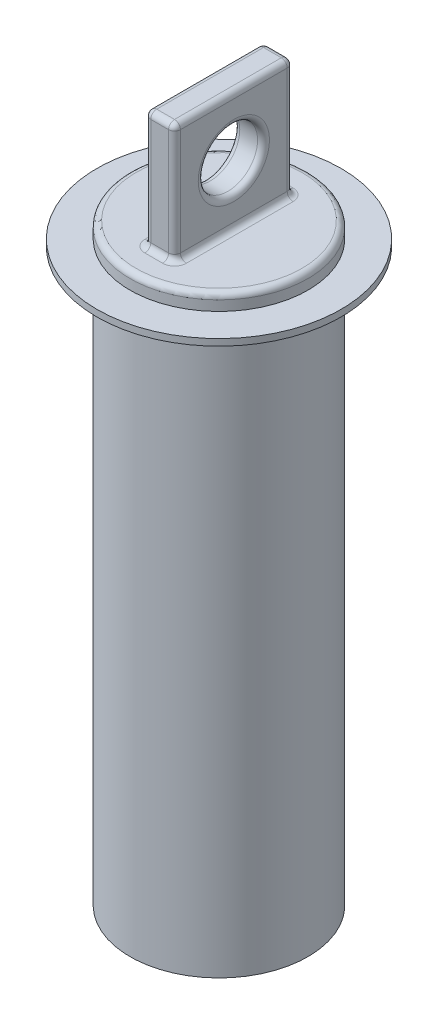
ISO-10303-21;
HEADER;
FILE_DESCRIPTION(('STEP AP214'),'2;1');
FILE_NAME('part.step','',(''),(''),'','','');
FILE_SCHEMA(('AUTOMOTIVE_DESIGN { 1 0 10303 214 1 1 1 1 }'));
ENDSEC;
DATA;
#1=APPLICATION_CONTEXT('core data for automotive mechanical design processes');
#2=APPLICATION_PROTOCOL_DEFINITION('international standard','automotive_design',2000,#1);
#3=PRODUCT_CONTEXT('',#1,'mechanical');
#4=PRODUCT('Part','Part','',(#3));
#5=PRODUCT_RELATED_PRODUCT_CATEGORY('part','',(#4));
#6=PRODUCT_DEFINITION_FORMATION('','',#4);
#7=PRODUCT_DEFINITION_CONTEXT('part definition',#1,'design');
#8=PRODUCT_DEFINITION('design','',#6,#7);
#9=PRODUCT_DEFINITION_SHAPE('','',#8);
#10=(LENGTH_UNIT() NAMED_UNIT(*) SI_UNIT(.MILLI.,.METRE.));
#11=(NAMED_UNIT(*) PLANE_ANGLE_UNIT() SI_UNIT($,.RADIAN.));
#12=(NAMED_UNIT(*) SI_UNIT($,.STERADIAN.) SOLID_ANGLE_UNIT());
#13=UNCERTAINTY_MEASURE_WITH_UNIT(LENGTH_MEASURE(1.E-05),#10,'distance_accuracy_value','');
#14=(GEOMETRIC_REPRESENTATION_CONTEXT(3) GLOBAL_UNCERTAINTY_ASSIGNED_CONTEXT((#13)) GLOBAL_UNIT_ASSIGNED_CONTEXT((#10,
#11,#12)) REPRESENTATION_CONTEXT('',''));
#15=CARTESIAN_POINT('',(0.,0.,0.));
#16=DIRECTION('',(0.,0.,1.));
#17=DIRECTION('',(1.,0.,0.));
#18=AXIS2_PLACEMENT_3D('',#15,#16,#17);
#19=CARTESIAN_POINT('',(0.,40.,0.));
#20=DIRECTION('',(0.,-1.,0.));
#21=DIRECTION('',(0.,0.,-1.));
#22=AXIS2_PLACEMENT_3D('',#19,#20,#21);
#23=PLANE('',#22);
#24=CARTESIAN_POINT('',(0.,40.,0.));
#25=DIRECTION('',(0.,-1.,0.));
#26=DIRECTION('',(0.,0.,-1.));
#27=AXIS2_PLACEMENT_3D('',#24,#25,#26);
#28=CIRCLE('',#27,14.);
#29=CARTESIAN_POINT('',(0.,40.,-14.));
#30=VERTEX_POINT('',#29);
#31=EDGE_CURVE('E162',#30,#30,#28,.F.);
#32=ORIENTED_EDGE('',*,*,#31,.T.);
#33=EDGE_LOOP('',(#32));
#34=FACE_BOUND('',#33,.T.);
#35=CARTESIAN_POINT('',(-1.5,40.,-9.00000000000001));
#36=DIRECTION('',(0.,-1.,0.));
#37=DIRECTION('',(0.,0.,-1.));
#38=AXIS2_PLACEMENT_3D('',#35,#36,#37);
#39=CIRCLE('',#38,2.);
#40=CARTESIAN_POINT('',(-1.5,40.,-11.));
#41=VERTEX_POINT('',#40);
#42=CARTESIAN_POINT('',(-3.5,40.,-9.00000000000001));
#43=VERTEX_POINT('',#42);
#44=EDGE_CURVE('E143',#41,#43,#39,.F.);
#45=ORIENTED_EDGE('',*,*,#44,.F.);
#46=DIRECTION('',(-1.,0.,0.));
#47=VECTOR('',#46,1.);
#48=CARTESIAN_POINT('',(2.5,40.,-11.));
#49=LINE('',#48,#47);
#50=CARTESIAN_POINT('',(1.5,40.,-11.));
#51=VERTEX_POINT('',#50);
#52=EDGE_CURVE('E145',#41,#51,#49,.F.);
#53=ORIENTED_EDGE('',*,*,#52,.T.);
#54=CARTESIAN_POINT('',(1.5,40.,-9.00000000000001));
#55=DIRECTION('',(0.,-1.,0.));
#56=DIRECTION('',(0.,0.,-1.));
#57=AXIS2_PLACEMENT_3D('',#54,#55,#56);
#58=CIRCLE('',#57,2.);
#59=CARTESIAN_POINT('',(3.5,40.,-9.00000000000001));
#60=VERTEX_POINT('',#59);
#61=EDGE_CURVE('E163',#60,#51,#58,.F.);
#62=ORIENTED_EDGE('',*,*,#61,.F.);
#63=DIRECTION('',(0.,0.,-1.));
#64=VECTOR('',#63,1.);
#65=CARTESIAN_POINT('',(3.5,40.,10.));
#66=LINE('',#65,#64);
#67=CARTESIAN_POINT('',(3.5,40.,9.));
#68=VERTEX_POINT('',#67);
#69=EDGE_CURVE('E231',#60,#68,#66,.F.);
#70=ORIENTED_EDGE('',*,*,#69,.T.);
#71=CARTESIAN_POINT('',(1.5,40.,9.));
#72=DIRECTION('',(0.,-1.,0.));
#73=DIRECTION('',(0.,0.,-1.));
#74=AXIS2_PLACEMENT_3D('',#71,#72,#73);
#75=CIRCLE('',#74,2.);
#76=CARTESIAN_POINT('',(1.5,40.,11.));
#77=VERTEX_POINT('',#76);
#78=EDGE_CURVE('E228',#77,#68,#75,.F.);
#79=ORIENTED_EDGE('',*,*,#78,.F.);
#80=DIRECTION('',(1.,0.,0.));
#81=VECTOR('',#80,1.);
#82=CARTESIAN_POINT('',(-2.5,40.,11.));
#83=LINE('',#82,#81);
#84=CARTESIAN_POINT('',(-1.5,40.,11.));
#85=VERTEX_POINT('',#84);
#86=EDGE_CURVE('E226',#77,#85,#83,.F.);
#87=ORIENTED_EDGE('',*,*,#86,.T.);
#88=CARTESIAN_POINT('',(-1.5,40.,9.));
#89=DIRECTION('',(0.,-1.,0.));
#90=DIRECTION('',(0.,0.,-1.));
#91=AXIS2_PLACEMENT_3D('',#88,#89,#90);
#92=CIRCLE('',#91,2.);
#93=CARTESIAN_POINT('',(-3.5,40.,9.));
#94=VERTEX_POINT('',#93);
#95=EDGE_CURVE('E223',#94,#85,#92,.F.);
#96=ORIENTED_EDGE('',*,*,#95,.F.);
#97=DIRECTION('',(0.,0.,1.));
#98=VECTOR('',#97,1.);
#99=CARTESIAN_POINT('',(-3.5,40.,-10.));
#100=LINE('',#99,#98);
#101=EDGE_CURVE('E147',#94,#43,#100,.F.);
#102=ORIENTED_EDGE('',*,*,#101,.T.);
#103=EDGE_LOOP('',(#45,#53,#62,#70,#79,#87,#96,#102));
#104=FACE_BOUND('',#103,.T.);
#105=ADVANCED_FACE('F41',(#34,#104),#23,.F.);
#106=CARTESIAN_POINT('',(0.,0.,0.));
#107=DIRECTION('',(0.,-1.,0.));
#108=DIRECTION('',(0.,0.,-1.));
#109=AXIS2_PLACEMENT_3D('',#106,#107,#108);
#110=CYLINDRICAL_SURFACE('',#109,15.);
#111=CARTESIAN_POINT('',(0.,37.3091138528855,0.));
#112=DIRECTION('',(0.,-1.,0.));
#113=DIRECTION('',(0.,0.,-1.));
#114=AXIS2_PLACEMENT_3D('',#111,#112,#113);
#115=CIRCLE('',#114,15.);
#116=CARTESIAN_POINT('',(0.,37.3091138528855,-15.));
#117=VERTEX_POINT('',#116);
#118=EDGE_CURVE('E750',#117,#117,#115,.T.);
#119=ORIENTED_EDGE('',*,*,#118,.F.);
#120=EDGE_LOOP('',(#119));
#121=FACE_BOUND('',#120,.T.);
#122=CARTESIAN_POINT('',(0.,39.,0.));
#123=DIRECTION('',(0.,-1.,0.));
#124=DIRECTION('',(0.,0.,-1.));
#125=AXIS2_PLACEMENT_3D('',#122,#123,#124);
#126=CIRCLE('',#125,15.);
#127=CARTESIAN_POINT('',(0.,39.,-15.));
#128=VERTEX_POINT('',#127);
#129=EDGE_CURVE('E152',#128,#128,#126,.T.);
#130=ORIENTED_EDGE('',*,*,#129,.T.);
#131=EDGE_LOOP('',(#130));
#132=FACE_BOUND('',#131,.T.);
#133=ADVANCED_FACE('F372',(#121,#132),#110,.T.);
#134=CARTESIAN_POINT('',(-2.5,60.,10.));
#135=DIRECTION('',(1.,0.,0.));
#136=DIRECTION('',(0.,0.,-1.));
#137=AXIS2_PLACEMENT_3D('',#134,#135,#136);
#138=PLANE('',#137);
#139=DIRECTION('',(0.,-1.,0.));
#140=VECTOR('',#139,1.);
#141=CARTESIAN_POINT('',(-2.5,60.,9.));
#142=LINE('',#141,#140);
#143=CARTESIAN_POINT('',(-2.5,41.,9.));
#144=VERTEX_POINT('',#143);
#145=CARTESIAN_POINT('',(-2.5,59.,9.));
#146=VERTEX_POINT('',#145);
#147=EDGE_CURVE('E258',#144,#146,#142,.F.);
#148=ORIENTED_EDGE('',*,*,#147,.T.);
#149=DIRECTION('',(0.,0.,1.));
#150=VECTOR('',#149,1.);
#151=CARTESIAN_POINT('',(-2.5,59.,-10.));
#152=LINE('',#151,#150);
#153=CARTESIAN_POINT('',(-2.5,59.,-9.00000000000001));
#154=VERTEX_POINT('',#153);
#155=EDGE_CURVE('E261',#146,#154,#152,.F.);
#156=ORIENTED_EDGE('',*,*,#155,.T.);
#157=DIRECTION('',(0.,-1.,0.));
#158=VECTOR('',#157,1.);
#159=CARTESIAN_POINT('',(-2.5,60.,-9.00000000000001));
#160=LINE('',#159,#158);
#161=CARTESIAN_POINT('',(-2.5,41.,-9.00000000000001));
#162=VERTEX_POINT('',#161);
#163=EDGE_CURVE('E256',#154,#162,#160,.T.);
#164=ORIENTED_EDGE('',*,*,#163,.T.);
#165=DIRECTION('',(0.,0.,1.));
#166=VECTOR('',#165,1.);
#167=CARTESIAN_POINT('',(-2.5,41.,10.));
#168=LINE('',#167,#166);
#169=EDGE_CURVE('E254',#162,#144,#168,.T.);
#170=ORIENTED_EDGE('',*,*,#169,.T.);
#171=EDGE_LOOP('',(#148,#156,#164,#170));
#172=FACE_BOUND('',#171,.T.);
#173=CARTESIAN_POINT('',(-2.5,50.,0.));
#174=DIRECTION('',(1.,0.,0.));
#175=DIRECTION('',(0.,0.,-1.));
#176=AXIS2_PLACEMENT_3D('',#173,#174,#175);
#177=CIRCLE('',#176,6.);
#178=CARTESIAN_POINT('',(-2.5,50.,-6.));
#179=VERTEX_POINT('',#178);
#180=EDGE_CURVE('E251',#179,#179,#177,.T.);
#181=ORIENTED_EDGE('',*,*,#180,.T.);
#182=EDGE_LOOP('',(#181));
#183=FACE_BOUND('',#182,.T.);
#184=ADVANCED_FACE('F380',(#172,#183),#138,.F.);
#185=CARTESIAN_POINT('',(2.5,60.,10.));
#186=DIRECTION('',(0.,0.,-1.));
#187=DIRECTION('',(-1.,0.,0.));
#188=AXIS2_PLACEMENT_3D('',#185,#186,#187);
#189=PLANE('',#188);
#190=DIRECTION('',(0.,-1.,0.));
#191=VECTOR('',#190,1.);
#192=CARTESIAN_POINT('',(1.5,60.,10.));
#193=LINE('',#192,#191);
#194=CARTESIAN_POINT('',(1.5,41.,10.));
#195=VERTEX_POINT('',#194);
#196=CARTESIAN_POINT('',(1.5,59.,10.));
#197=VERTEX_POINT('',#196);
#198=EDGE_CURVE('E244',#195,#197,#193,.F.);
#199=ORIENTED_EDGE('',*,*,#198,.T.);
#200=DIRECTION('',(1.,0.,0.));
#201=VECTOR('',#200,1.);
#202=CARTESIAN_POINT('',(-2.5,59.,10.));
#203=LINE('',#202,#201);
#204=CARTESIAN_POINT('',(-1.5,59.,10.));
#205=VERTEX_POINT('',#204);
#206=EDGE_CURVE('E249',#197,#205,#203,.F.);
#207=ORIENTED_EDGE('',*,*,#206,.T.);
#208=DIRECTION('',(0.,-1.,0.));
#209=VECTOR('',#208,1.);
#210=CARTESIAN_POINT('',(-1.5,60.,10.));
#211=LINE('',#210,#209);
#212=CARTESIAN_POINT('',(-1.5,41.,10.));
#213=VERTEX_POINT('',#212);
#214=EDGE_CURVE('E246',#205,#213,#211,.T.);
#215=ORIENTED_EDGE('',*,*,#214,.T.);
#216=DIRECTION('',(1.,0.,0.));
#217=VECTOR('',#216,1.);
#218=CARTESIAN_POINT('',(2.5,41.,10.));
#219=LINE('',#218,#217);
#220=EDGE_CURVE('E242',#213,#195,#219,.T.);
#221=ORIENTED_EDGE('',*,*,#220,.T.);
#222=EDGE_LOOP('',(#199,#207,#215,#221));
#223=FACE_BOUND('',#222,.T.);
#224=ADVANCED_FACE('F344',(#223),#189,.F.);
#225=CARTESIAN_POINT('',(2.5,60.,10.));
#226=DIRECTION('',(-1.,0.,0.));
#227=DIRECTION('',(0.,0.,1.));
#228=AXIS2_PLACEMENT_3D('',#225,#226,#227);
#229=PLANE('',#228);
#230=DIRECTION('',(0.,-1.,0.));
#231=VECTOR('',#230,1.);
#232=CARTESIAN_POINT('',(2.5,60.,-9.00000000000001));
#233=LINE('',#232,#231);
#234=CARTESIAN_POINT('',(2.5,41.,-9.00000000000001));
#235=VERTEX_POINT('',#234);
#236=CARTESIAN_POINT('',(2.5,59.,-9.00000000000001));
#237=VERTEX_POINT('',#236);
#238=EDGE_CURVE('E268',#235,#237,#233,.F.);
#239=ORIENTED_EDGE('',*,*,#238,.T.);
#240=DIRECTION('',(0.,0.,-1.));
#241=VECTOR('',#240,1.);
#242=CARTESIAN_POINT('',(2.5,59.,10.));
#243=LINE('',#242,#241);
#244=CARTESIAN_POINT('',(2.5,59.,9.));
#245=VERTEX_POINT('',#244);
#246=EDGE_CURVE('E273',#237,#245,#243,.F.);
#247=ORIENTED_EDGE('',*,*,#246,.T.);
#248=DIRECTION('',(0.,-1.,0.));
#249=VECTOR('',#248,1.);
#250=CARTESIAN_POINT('',(2.5,60.,9.));
#251=LINE('',#250,#249);
#252=CARTESIAN_POINT('',(2.5,41.,9.));
#253=VERTEX_POINT('',#252);
#254=EDGE_CURVE('E270',#245,#253,#251,.T.);
#255=ORIENTED_EDGE('',*,*,#254,.T.);
#256=DIRECTION('',(0.,0.,-1.));
#257=VECTOR('',#256,1.);
#258=CARTESIAN_POINT('',(2.5,41.,-10.));
#259=LINE('',#258,#257);
#260=EDGE_CURVE('E266',#253,#235,#259,.T.);
#261=ORIENTED_EDGE('',*,*,#260,.T.);
#262=EDGE_LOOP('',(#239,#247,#255,#261));
#263=FACE_BOUND('',#262,.T.);
#264=CARTESIAN_POINT('',(2.5,50.,0.));
#265=DIRECTION('',(-1.,0.,0.));
#266=DIRECTION('',(0.,0.,1.));
#267=AXIS2_PLACEMENT_3D('',#264,#265,#266);
#268=CIRCLE('',#267,6.);
#269=CARTESIAN_POINT('',(2.5,50.,6.));
#270=VERTEX_POINT('',#269);
#271=EDGE_CURVE('E263',#270,#270,#268,.T.);
#272=ORIENTED_EDGE('',*,*,#271,.T.);
#273=EDGE_LOOP('',(#272));
#274=FACE_BOUND('',#273,.T.);
#275=ADVANCED_FACE('F654',(#263,#274),#229,.F.);
#276=CARTESIAN_POINT('',(2.5,60.,-10.));
#277=DIRECTION('',(0.,0.,1.));
#278=DIRECTION('',(1.,0.,0.));
#279=AXIS2_PLACEMENT_3D('',#276,#277,#278);
#280=PLANE('',#279);
#281=DIRECTION('',(0.,-1.,0.));
#282=VECTOR('',#281,1.);
#283=CARTESIAN_POINT('',(-1.5,60.,-10.));
#284=LINE('',#283,#282);
#285=CARTESIAN_POINT('',(-1.5,41.,-10.));
#286=VERTEX_POINT('',#285);
#287=CARTESIAN_POINT('',(-1.5,59.,-10.));
#288=VERTEX_POINT('',#287);
#289=EDGE_CURVE('E277',#286,#288,#284,.F.);
#290=ORIENTED_EDGE('',*,*,#289,.T.);
#291=DIRECTION('',(-1.,0.,0.));
#292=VECTOR('',#291,1.);
#293=CARTESIAN_POINT('',(2.5,59.,-10.));
#294=LINE('',#293,#292);
#295=CARTESIAN_POINT('',(1.5,59.,-10.));
#296=VERTEX_POINT('',#295);
#297=EDGE_CURVE('E282',#288,#296,#294,.F.);
#298=ORIENTED_EDGE('',*,*,#297,.T.);
#299=DIRECTION('',(0.,-1.,0.));
#300=VECTOR('',#299,1.);
#301=CARTESIAN_POINT('',(1.5,60.,-10.));
#302=LINE('',#301,#300);
#303=CARTESIAN_POINT('',(1.5,41.,-10.));
#304=VERTEX_POINT('',#303);
#305=EDGE_CURVE('E279',#296,#304,#302,.T.);
#306=ORIENTED_EDGE('',*,*,#305,.T.);
#307=DIRECTION('',(-1.,0.,0.));
#308=VECTOR('',#307,1.);
#309=CARTESIAN_POINT('',(-2.5,41.,-10.));
#310=LINE('',#309,#308);
#311=EDGE_CURVE('E275',#304,#286,#310,.T.);
#312=ORIENTED_EDGE('',*,*,#311,.T.);
#313=EDGE_LOOP('',(#290,#298,#306,#312));
#314=FACE_BOUND('',#313,.T.);
#315=ADVANCED_FACE('F646',(#314),#280,.F.);
#316=CARTESIAN_POINT('',(0.,60.,0.));
#317=DIRECTION('',(0.,1.,0.));
#318=DIRECTION('',(0.,0.,1.));
#319=AXIS2_PLACEMENT_3D('',#316,#317,#318);
#320=PLANE('',#319);
#321=DIRECTION('',(0.,0.,-1.));
#322=VECTOR('',#321,1.);
#323=CARTESIAN_POINT('',(1.5,60.,-10.));
#324=LINE('',#323,#322);
#325=CARTESIAN_POINT('',(1.5,60.,9.));
#326=VERTEX_POINT('',#325);
#327=CARTESIAN_POINT('',(1.5,60.,-9.00000000000001));
#328=VERTEX_POINT('',#327);
#329=EDGE_CURVE('E58',#326,#328,#324,.T.);
#330=ORIENTED_EDGE('',*,*,#329,.T.);
#331=DIRECTION('',(-1.,0.,0.));
#332=VECTOR('',#331,1.);
#333=CARTESIAN_POINT('',(-2.5,60.,-9.00000000000001));
#334=LINE('',#333,#332);
#335=CARTESIAN_POINT('',(-1.5,60.,-9.00000000000001));
#336=VERTEX_POINT('',#335);
#337=EDGE_CURVE('E288',#328,#336,#334,.T.);
#338=ORIENTED_EDGE('',*,*,#337,.T.);
#339=DIRECTION('',(0.,0.,1.));
#340=VECTOR('',#339,1.);
#341=CARTESIAN_POINT('',(-1.5,60.,10.));
#342=LINE('',#341,#340);
#343=CARTESIAN_POINT('',(-1.5,60.,9.));
#344=VERTEX_POINT('',#343);
#345=EDGE_CURVE('E284',#336,#344,#342,.T.);
#346=ORIENTED_EDGE('',*,*,#345,.T.);
#347=DIRECTION('',(1.,0.,0.));
#348=VECTOR('',#347,1.);
#349=CARTESIAN_POINT('',(2.5,60.,9.));
#350=LINE('',#349,#348);
#351=EDGE_CURVE('E63',#344,#326,#350,.T.);
#352=ORIENTED_EDGE('',*,*,#351,.T.);
#353=EDGE_LOOP('',(#330,#338,#346,#352));
#354=FACE_BOUND('',#353,.T.);
#355=ADVANCED_FACE('F329',(#354),#320,.T.);
#356=CARTESIAN_POINT('',(-15.,50.,0.));
#357=DIRECTION('',(1.,0.,0.));
#358=DIRECTION('',(0.,0.,-1.));
#359=AXIS2_PLACEMENT_3D('',#356,#357,#358);
#360=CYLINDRICAL_SURFACE('',#359,5.);
#361=CARTESIAN_POINT('',(-1.5,50.,0.));
#362=DIRECTION('',(1.,0.,0.));
#363=DIRECTION('',(0.,0.,-1.));
#364=AXIS2_PLACEMENT_3D('',#361,#362,#363);
#365=CIRCLE('',#364,5.);
#366=CARTESIAN_POINT('',(-1.5,50.,-5.));
#367=VERTEX_POINT('',#366);
#368=EDGE_CURVE('E11',#367,#367,#365,.F.);
#369=ORIENTED_EDGE('',*,*,#368,.T.);
#370=EDGE_LOOP('',(#369));
#371=FACE_BOUND('',#370,.T.);
#372=CARTESIAN_POINT('',(1.5,50.,0.));
#373=DIRECTION('',(-1.,0.,0.));
#374=DIRECTION('',(0.,0.,1.));
#375=AXIS2_PLACEMENT_3D('',#372,#373,#374);
#376=CIRCLE('',#375,5.);
#377=CARTESIAN_POINT('',(1.5,50.,5.));
#378=VERTEX_POINT('',#377);
#379=EDGE_CURVE('E50',#378,#378,#376,.F.);
#380=ORIENTED_EDGE('',*,*,#379,.T.);
#381=EDGE_LOOP('',(#380));
#382=FACE_BOUND('',#381,.T.);
#383=ADVANCED_FACE('F393',(#371,#382),#360,.F.);
#384=CARTESIAN_POINT('',(0.,39.,0.));
#385=DIRECTION('',(0.,-1.,0.));
#386=DIRECTION('',(0.,0.,-1.));
#387=AXIS2_PLACEMENT_3D('',#384,#385,#386);
#388=TOROIDAL_SURFACE('',#387,14.,1.);
#389=ORIENTED_EDGE('',*,*,#31,.F.);
#390=EDGE_LOOP('',(#389));
#391=FACE_BOUND('',#390,.T.);
#392=ORIENTED_EDGE('',*,*,#129,.F.);
#393=EDGE_LOOP('',(#392));
#394=FACE_BOUND('',#393,.T.);
#395=ADVANCED_FACE('F368',(#391,#394),#388,.T.);
#396=CARTESIAN_POINT('',(1.5,60.,-9.00000000000001));
#397=DIRECTION('',(0.,-1.,0.));
#398=DIRECTION('',(0.,0.,-1.));
#399=AXIS2_PLACEMENT_3D('',#396,#397,#398);
#400=CYLINDRICAL_SURFACE('',#399,1.);
#401=CARTESIAN_POINT('',(1.5,59.,-9.00000000000001));
#402=DIRECTION('',(0.,1.,0.));
#403=DIRECTION('',(0.,0.,1.));
#404=AXIS2_PLACEMENT_3D('',#401,#402,#403);
#405=CIRCLE('',#404,1.);
#406=EDGE_CURVE('E45',#237,#296,#405,.T.);
#407=ORIENTED_EDGE('',*,*,#406,.F.);
#408=ORIENTED_EDGE('',*,*,#238,.F.);
#409=CARTESIAN_POINT('',(1.5,41.,-9.00000000000001));
#410=DIRECTION('',(0.,-1.,0.));
#411=DIRECTION('',(0.,0.,-1.));
#412=AXIS2_PLACEMENT_3D('',#409,#410,#411);
#413=CIRCLE('',#412,1.);
#414=EDGE_CURVE('E198',#304,#235,#413,.T.);
#415=ORIENTED_EDGE('',*,*,#414,.F.);
#416=ORIENTED_EDGE('',*,*,#305,.F.);
#417=EDGE_LOOP('',(#407,#408,#415,#416));
#418=FACE_BOUND('',#417,.T.);
#419=ADVANCED_FACE('F361',(#418),#400,.T.);
#420=CARTESIAN_POINT('',(1.5,59.,-9.00000000000001));
#421=DIRECTION('',(0.,0.,-1.));
#422=DIRECTION('',(-1.,0.,0.));
#423=AXIS2_PLACEMENT_3D('',#420,#421,#422);
#424=SPHERICAL_SURFACE('',#423,1.);
#425=CARTESIAN_POINT('',(1.5,59.,-9.00000000000001));
#426=DIRECTION('',(0.,0.,-1.));
#427=DIRECTION('',(-1.,0.,0.));
#428=AXIS2_PLACEMENT_3D('',#425,#426,#427);
#429=CIRCLE('',#428,1.);
#430=EDGE_CURVE('E194',#237,#328,#429,.F.);
#431=ORIENTED_EDGE('',*,*,#430,.F.);
#432=ORIENTED_EDGE('',*,*,#406,.T.);
#433=CARTESIAN_POINT('',(1.5,59.,-9.00000000000001));
#434=DIRECTION('',(1.,0.,0.));
#435=DIRECTION('',(0.,0.,-1.));
#436=AXIS2_PLACEMENT_3D('',#433,#434,#435);
#437=CIRCLE('',#436,1.);
#438=EDGE_CURVE('E196',#328,#296,#437,.F.);
#439=ORIENTED_EDGE('',*,*,#438,.F.);
#440=EDGE_LOOP('',(#431,#432,#439));
#441=FACE_BOUND('',#440,.T.);
#442=ADVANCED_FACE('F358',(#441),#424,.T.);
#443=CARTESIAN_POINT('',(1.5,41.,-9.00000000000001));
#444=DIRECTION('',(0.,-1.,0.));
#445=DIRECTION('',(0.,0.,-1.));
#446=AXIS2_PLACEMENT_3D('',#443,#444,#445);
#447=TOROIDAL_SURFACE('',#446,2.,1.);
#448=CARTESIAN_POINT('',(1.5,41.,-11.));
#449=DIRECTION('',(-1.,0.,0.));
#450=DIRECTION('',(0.,0.,1.));
#451=AXIS2_PLACEMENT_3D('',#448,#449,#450);
#452=CIRCLE('',#451,1.);
#453=EDGE_CURVE('E160',#304,#51,#452,.F.);
#454=ORIENTED_EDGE('',*,*,#453,.F.);
#455=ORIENTED_EDGE('',*,*,#414,.T.);
#456=CARTESIAN_POINT('',(3.5,41.,-9.00000000000001));
#457=DIRECTION('',(0.,0.,1.));
#458=DIRECTION('',(1.,0.,0.));
#459=AXIS2_PLACEMENT_3D('',#456,#457,#458);
#460=CIRCLE('',#459,1.);
#461=EDGE_CURVE('E191',#60,#235,#460,.F.);
#462=ORIENTED_EDGE('',*,*,#461,.F.);
#463=ORIENTED_EDGE('',*,*,#61,.T.);
#464=EDGE_LOOP('',(#454,#455,#462,#463));
#465=FACE_BOUND('',#464,.T.);
#466=ADVANCED_FACE('F360',(#465),#447,.F.);
#467=CARTESIAN_POINT('',(0.,59.,-9.00000000000001));
#468=DIRECTION('',(1.,0.,0.));
#469=DIRECTION('',(0.,0.,-1.));
#470=AXIS2_PLACEMENT_3D('',#467,#468,#469);
#471=CYLINDRICAL_SURFACE('',#470,1.);
#472=ORIENTED_EDGE('',*,*,#438,.T.);
#473=ORIENTED_EDGE('',*,*,#297,.F.);
#474=CARTESIAN_POINT('',(-1.5,59.,-9.00000000000001));
#475=DIRECTION('',(-1.,0.,0.));
#476=DIRECTION('',(0.,0.,1.));
#477=AXIS2_PLACEMENT_3D('',#474,#475,#476);
#478=CIRCLE('',#477,1.);
#479=EDGE_CURVE('E184',#336,#288,#478,.T.);
#480=ORIENTED_EDGE('',*,*,#479,.F.);
#481=ORIENTED_EDGE('',*,*,#337,.F.);
#482=EDGE_LOOP('',(#472,#473,#480,#481));
#483=FACE_BOUND('',#482,.T.);
#484=ADVANCED_FACE('F328',(#483),#471,.T.);
#485=CARTESIAN_POINT('',(1.5,59.,0.));
#486=DIRECTION('',(0.,0.,1.));
#487=DIRECTION('',(1.,0.,0.));
#488=AXIS2_PLACEMENT_3D('',#485,#486,#487);
#489=CYLINDRICAL_SURFACE('',#488,1.);
#490=ORIENTED_EDGE('',*,*,#430,.T.);
#491=ORIENTED_EDGE('',*,*,#329,.F.);
#492=CARTESIAN_POINT('',(1.5,59.,9.));
#493=DIRECTION('',(0.,0.,1.));
#494=DIRECTION('',(1.,0.,0.));
#495=AXIS2_PLACEMENT_3D('',#492,#493,#494);
#496=CIRCLE('',#495,1.);
#497=EDGE_CURVE('E181',#245,#326,#496,.T.);
#498=ORIENTED_EDGE('',*,*,#497,.F.);
#499=ORIENTED_EDGE('',*,*,#246,.F.);
#500=EDGE_LOOP('',(#490,#491,#498,#499));
#501=FACE_BOUND('',#500,.T.);
#502=ADVANCED_FACE('F357',(#501),#489,.T.);
#503=CARTESIAN_POINT('',(1.5,60.,9.));
#504=DIRECTION('',(0.,-1.,0.));
#505=DIRECTION('',(0.,0.,-1.));
#506=AXIS2_PLACEMENT_3D('',#503,#504,#505);
#507=CYLINDRICAL_SURFACE('',#506,1.);
#508=CARTESIAN_POINT('',(1.5,41.,9.));
#509=DIRECTION('',(0.,-1.,0.));
#510=DIRECTION('',(0.,0.,-1.));
#511=AXIS2_PLACEMENT_3D('',#508,#509,#510);
#512=CIRCLE('',#511,1.);
#513=EDGE_CURVE('E170',#253,#195,#512,.T.);
#514=ORIENTED_EDGE('',*,*,#513,.F.);
#515=ORIENTED_EDGE('',*,*,#254,.F.);
#516=CARTESIAN_POINT('',(1.5,59.,9.));
#517=DIRECTION('',(0.,1.,0.));
#518=DIRECTION('',(0.,0.,1.));
#519=AXIS2_PLACEMENT_3D('',#516,#517,#518);
#520=CIRCLE('',#519,1.);
#521=EDGE_CURVE('E178',#197,#245,#520,.T.);
#522=ORIENTED_EDGE('',*,*,#521,.F.);
#523=ORIENTED_EDGE('',*,*,#198,.F.);
#524=EDGE_LOOP('',(#514,#515,#522,#523));
#525=FACE_BOUND('',#524,.T.);
#526=ADVANCED_FACE('F351',(#525),#507,.T.);
#527=CARTESIAN_POINT('',(3.5,41.,10.));
#528=DIRECTION('',(0.,0.,1.));
#529=DIRECTION('',(1.,0.,0.));
#530=AXIS2_PLACEMENT_3D('',#527,#528,#529);
#531=CYLINDRICAL_SURFACE('',#530,1.);
#532=ORIENTED_EDGE('',*,*,#461,.T.);
#533=ORIENTED_EDGE('',*,*,#260,.F.);
#534=CARTESIAN_POINT('',(3.5,41.,9.));
#535=DIRECTION('',(0.,0.,-1.));
#536=DIRECTION('',(-1.,0.,0.));
#537=AXIS2_PLACEMENT_3D('',#534,#535,#536);
#538=CIRCLE('',#537,1.);
#539=EDGE_CURVE('E168',#68,#253,#538,.T.);
#540=ORIENTED_EDGE('',*,*,#539,.F.);
#541=ORIENTED_EDGE('',*,*,#69,.F.);
#542=EDGE_LOOP('',(#532,#533,#540,#541));
#543=FACE_BOUND('',#542,.T.);
#544=ADVANCED_FACE('F436',(#543),#531,.F.);
#545=CARTESIAN_POINT('',(2.5,41.,-11.));
#546=DIRECTION('',(1.,0.,0.));
#547=DIRECTION('',(0.,0.,-1.));
#548=AXIS2_PLACEMENT_3D('',#545,#546,#547);
#549=CYLINDRICAL_SURFACE('',#548,1.);
#550=ORIENTED_EDGE('',*,*,#453,.T.);
#551=ORIENTED_EDGE('',*,*,#52,.F.);
#552=CARTESIAN_POINT('',(-1.5,41.,-11.));
#553=DIRECTION('',(1.,0.,0.));
#554=DIRECTION('',(0.,0.,-1.));
#555=AXIS2_PLACEMENT_3D('',#552,#553,#554);
#556=CIRCLE('',#555,1.);
#557=EDGE_CURVE('E157',#286,#41,#556,.T.);
#558=ORIENTED_EDGE('',*,*,#557,.F.);
#559=ORIENTED_EDGE('',*,*,#311,.F.);
#560=EDGE_LOOP('',(#550,#551,#558,#559));
#561=FACE_BOUND('',#560,.T.);
#562=ADVANCED_FACE('F156',(#561),#549,.F.);
#563=CARTESIAN_POINT('',(-1.5,60.,-9.00000000000001));
#564=DIRECTION('',(0.,-1.,0.));
#565=DIRECTION('',(0.,0.,-1.));
#566=AXIS2_PLACEMENT_3D('',#563,#564,#565);
#567=CYLINDRICAL_SURFACE('',#566,1.);
#568=CARTESIAN_POINT('',(-1.5,59.,-9.00000000000001));
#569=DIRECTION('',(0.,1.,0.));
#570=DIRECTION('',(0.,0.,1.));
#571=AXIS2_PLACEMENT_3D('',#568,#569,#570);
#572=CIRCLE('',#571,1.);
#573=EDGE_CURVE('E187',#288,#154,#572,.T.);
#574=ORIENTED_EDGE('',*,*,#573,.F.);
#575=ORIENTED_EDGE('',*,*,#289,.F.);
#576=CARTESIAN_POINT('',(-1.5,41.,-9.00000000000001));
#577=DIRECTION('',(0.,-1.,0.));
#578=DIRECTION('',(0.,0.,-1.));
#579=AXIS2_PLACEMENT_3D('',#576,#577,#578);
#580=CIRCLE('',#579,1.);
#581=EDGE_CURVE('E167',#162,#286,#580,.T.);
#582=ORIENTED_EDGE('',*,*,#581,.F.);
#583=ORIENTED_EDGE('',*,*,#163,.F.);
#584=EDGE_LOOP('',(#574,#575,#582,#583));
#585=FACE_BOUND('',#584,.T.);
#586=ADVANCED_FACE('F430',(#585),#567,.T.);
#587=CARTESIAN_POINT('',(-1.5,59.,-9.00000000000001));
#588=DIRECTION('',(0.,0.,-1.));
#589=DIRECTION('',(-1.,0.,0.));
#590=AXIS2_PLACEMENT_3D('',#587,#588,#589);
#591=SPHERICAL_SURFACE('',#590,1.);
#592=ORIENTED_EDGE('',*,*,#479,.T.);
#593=ORIENTED_EDGE('',*,*,#573,.T.);
#594=CARTESIAN_POINT('',(-1.5,59.,-9.00000000000001));
#595=DIRECTION('',(0.,0.,-1.));
#596=DIRECTION('',(0.,1.,0.));
#597=AXIS2_PLACEMENT_3D('',#594,#595,#596);
#598=CIRCLE('',#597,1.);
#599=EDGE_CURVE('E172',#336,#154,#598,.F.);
#600=ORIENTED_EDGE('',*,*,#599,.F.);
#601=EDGE_LOOP('',(#592,#593,#600));
#602=FACE_BOUND('',#601,.T.);
#603=ADVANCED_FACE('F323',(#602),#591,.T.);
#604=CARTESIAN_POINT('',(1.5,59.,9.));
#605=DIRECTION('',(1.,0.,0.));
#606=DIRECTION('',(0.,0.,-1.));
#607=AXIS2_PLACEMENT_3D('',#604,#605,#606);
#608=SPHERICAL_SURFACE('',#607,1.);
#609=ORIENTED_EDGE('',*,*,#521,.T.);
#610=ORIENTED_EDGE('',*,*,#497,.T.);
#611=CARTESIAN_POINT('',(1.5,59.,9.));
#612=DIRECTION('',(1.,0.,0.));
#613=DIRECTION('',(0.,0.,-1.));
#614=AXIS2_PLACEMENT_3D('',#611,#612,#613);
#615=CIRCLE('',#614,1.);
#616=EDGE_CURVE('E313',#197,#326,#615,.F.);
#617=ORIENTED_EDGE('',*,*,#616,.F.);
#618=EDGE_LOOP('',(#609,#610,#617));
#619=FACE_BOUND('',#618,.T.);
#620=ADVANCED_FACE('F354',(#619),#608,.T.);
#621=CARTESIAN_POINT('',(1.5,41.,9.));
#622=DIRECTION('',(0.,-1.,0.));
#623=DIRECTION('',(0.,0.,-1.));
#624=AXIS2_PLACEMENT_3D('',#621,#622,#623);
#625=TOROIDAL_SURFACE('',#624,2.,1.);
#626=ORIENTED_EDGE('',*,*,#539,.T.);
#627=ORIENTED_EDGE('',*,*,#513,.T.);
#628=CARTESIAN_POINT('',(1.5,41.,11.));
#629=DIRECTION('',(-1.,0.,0.));
#630=DIRECTION('',(0.,0.,1.));
#631=AXIS2_PLACEMENT_3D('',#628,#629,#630);
#632=CIRCLE('',#631,1.);
#633=EDGE_CURVE('E310',#77,#195,#632,.F.);
#634=ORIENTED_EDGE('',*,*,#633,.F.);
#635=ORIENTED_EDGE('',*,*,#78,.T.);
#636=EDGE_LOOP('',(#626,#627,#634,#635));
#637=FACE_BOUND('',#636,.T.);
#638=ADVANCED_FACE('F422',(#637),#625,.F.);
#639=CARTESIAN_POINT('',(-1.5,41.,-9.00000000000001));
#640=DIRECTION('',(0.,-1.,0.));
#641=DIRECTION('',(0.,0.,-1.));
#642=AXIS2_PLACEMENT_3D('',#639,#640,#641);
#643=TOROIDAL_SURFACE('',#642,2.,1.);
#644=ORIENTED_EDGE('',*,*,#557,.T.);
#645=ORIENTED_EDGE('',*,*,#44,.T.);
#646=CARTESIAN_POINT('',(-3.5,41.,-9.00000000000001));
#647=DIRECTION('',(0.,0.,1.));
#648=DIRECTION('',(1.,0.,0.));
#649=AXIS2_PLACEMENT_3D('',#646,#647,#648);
#650=CIRCLE('',#649,1.);
#651=EDGE_CURVE('E308',#162,#43,#650,.F.);
#652=ORIENTED_EDGE('',*,*,#651,.F.);
#653=ORIENTED_EDGE('',*,*,#581,.T.);
#654=EDGE_LOOP('',(#644,#645,#652,#653));
#655=FACE_BOUND('',#654,.T.);
#656=ADVANCED_FACE('F165',(#655),#643,.F.);
#657=CARTESIAN_POINT('',(-1.5,59.,0.));
#658=DIRECTION('',(0.,0.,-1.));
#659=DIRECTION('',(-1.,0.,0.));
#660=AXIS2_PLACEMENT_3D('',#657,#658,#659);
#661=CYLINDRICAL_SURFACE('',#660,1.);
#662=ORIENTED_EDGE('',*,*,#599,.T.);
#663=ORIENTED_EDGE('',*,*,#155,.F.);
#664=CARTESIAN_POINT('',(-1.5,59.,9.));
#665=DIRECTION('',(0.,0.,1.));
#666=DIRECTION('',(1.,0.,0.));
#667=AXIS2_PLACEMENT_3D('',#664,#665,#666);
#668=CIRCLE('',#667,1.);
#669=EDGE_CURVE('E305',#344,#146,#668,.T.);
#670=ORIENTED_EDGE('',*,*,#669,.F.);
#671=ORIENTED_EDGE('',*,*,#345,.F.);
#672=EDGE_LOOP('',(#662,#663,#670,#671));
#673=FACE_BOUND('',#672,.T.);
#674=ADVANCED_FACE('F319',(#673),#661,.T.);
#675=CARTESIAN_POINT('',(0.,59.,9.));
#676=DIRECTION('',(-1.,0.,0.));
#677=DIRECTION('',(0.,0.,1.));
#678=AXIS2_PLACEMENT_3D('',#675,#676,#677);
#679=CYLINDRICAL_SURFACE('',#678,1.);
#680=ORIENTED_EDGE('',*,*,#616,.T.);
#681=ORIENTED_EDGE('',*,*,#351,.F.);
#682=CARTESIAN_POINT('',(-1.5,59.,9.));
#683=DIRECTION('',(-1.,0.,0.));
#684=DIRECTION('',(0.,0.,1.));
#685=AXIS2_PLACEMENT_3D('',#682,#683,#684);
#686=CIRCLE('',#685,1.);
#687=EDGE_CURVE('E302',#205,#344,#686,.T.);
#688=ORIENTED_EDGE('',*,*,#687,.F.);
#689=ORIENTED_EDGE('',*,*,#206,.F.);
#690=EDGE_LOOP('',(#680,#681,#688,#689));
#691=FACE_BOUND('',#690,.T.);
#692=ADVANCED_FACE('F332',(#691),#679,.T.);
#693=CARTESIAN_POINT('',(2.5,41.,11.));
#694=DIRECTION('',(-1.,0.,0.));
#695=DIRECTION('',(0.,0.,1.));
#696=AXIS2_PLACEMENT_3D('',#693,#694,#695);
#697=CYLINDRICAL_SURFACE('',#696,1.);
#698=ORIENTED_EDGE('',*,*,#633,.T.);
#699=ORIENTED_EDGE('',*,*,#220,.F.);
#700=CARTESIAN_POINT('',(-1.5,41.,11.));
#701=DIRECTION('',(1.,0.,0.));
#702=DIRECTION('',(0.,0.,-1.));
#703=AXIS2_PLACEMENT_3D('',#700,#701,#702);
#704=CIRCLE('',#703,1.);
#705=EDGE_CURVE('E299',#85,#213,#704,.T.);
#706=ORIENTED_EDGE('',*,*,#705,.F.);
#707=ORIENTED_EDGE('',*,*,#86,.F.);
#708=EDGE_LOOP('',(#698,#699,#706,#707));
#709=FACE_BOUND('',#708,.T.);
#710=ADVANCED_FACE('F411',(#709),#697,.F.);
#711=CARTESIAN_POINT('',(-3.5,41.,10.));
#712=DIRECTION('',(0.,0.,-1.));
#713=DIRECTION('',(-1.,0.,0.));
#714=AXIS2_PLACEMENT_3D('',#711,#712,#713);
#715=CYLINDRICAL_SURFACE('',#714,1.);
#716=ORIENTED_EDGE('',*,*,#651,.T.);
#717=ORIENTED_EDGE('',*,*,#101,.F.);
#718=CARTESIAN_POINT('',(-3.5,41.,9.));
#719=DIRECTION('',(0.,0.,-1.));
#720=DIRECTION('',(-1.,0.,0.));
#721=AXIS2_PLACEMENT_3D('',#718,#719,#720);
#722=CIRCLE('',#721,1.);
#723=EDGE_CURVE('E296',#144,#94,#722,.T.);
#724=ORIENTED_EDGE('',*,*,#723,.F.);
#725=ORIENTED_EDGE('',*,*,#169,.F.);
#726=EDGE_LOOP('',(#716,#717,#724,#725));
#727=FACE_BOUND('',#726,.T.);
#728=ADVANCED_FACE('F408',(#727),#715,.F.);
#729=CARTESIAN_POINT('',(-1.5,59.,9.));
#730=DIRECTION('',(0.,1.,0.));
#731=DIRECTION('',(0.,0.,1.));
#732=AXIS2_PLACEMENT_3D('',#729,#730,#731);
#733=SPHERICAL_SURFACE('',#732,1.);
#734=ORIENTED_EDGE('',*,*,#687,.T.);
#735=ORIENTED_EDGE('',*,*,#669,.T.);
#736=CARTESIAN_POINT('',(-1.5,59.,9.));
#737=DIRECTION('',(0.,1.,0.));
#738=DIRECTION('',(0.,0.,1.));
#739=AXIS2_PLACEMENT_3D('',#736,#737,#738);
#740=CIRCLE('',#739,1.);
#741=EDGE_CURVE('E294',#205,#146,#740,.F.);
#742=ORIENTED_EDGE('',*,*,#741,.F.);
#743=EDGE_LOOP('',(#734,#735,#742));
#744=FACE_BOUND('',#743,.T.);
#745=ADVANCED_FACE('F337',(#744),#733,.T.);
#746=CARTESIAN_POINT('',(-1.5,41.,9.));
#747=DIRECTION('',(0.,-1.,0.));
#748=DIRECTION('',(0.,0.,-1.));
#749=AXIS2_PLACEMENT_3D('',#746,#747,#748);
#750=TOROIDAL_SURFACE('',#749,2.,1.);
#751=ORIENTED_EDGE('',*,*,#95,.T.);
#752=ORIENTED_EDGE('',*,*,#705,.T.);
#753=CARTESIAN_POINT('',(-1.5,41.,9.));
#754=DIRECTION('',(0.,-1.,0.));
#755=DIRECTION('',(0.,0.,-1.));
#756=AXIS2_PLACEMENT_3D('',#753,#754,#755);
#757=CIRCLE('',#756,1.);
#758=EDGE_CURVE('E292',#144,#213,#757,.F.);
#759=ORIENTED_EDGE('',*,*,#758,.F.);
#760=ORIENTED_EDGE('',*,*,#723,.T.);
#761=EDGE_LOOP('',(#751,#752,#759,#760));
#762=FACE_BOUND('',#761,.T.);
#763=ADVANCED_FACE('F402',(#762),#750,.F.);
#764=CARTESIAN_POINT('',(-1.5,60.,9.));
#765=DIRECTION('',(0.,-1.,0.));
#766=DIRECTION('',(0.,0.,-1.));
#767=AXIS2_PLACEMENT_3D('',#764,#765,#766);
#768=CYLINDRICAL_SURFACE('',#767,1.);
#769=ORIENTED_EDGE('',*,*,#741,.T.);
#770=ORIENTED_EDGE('',*,*,#147,.F.);
#771=ORIENTED_EDGE('',*,*,#758,.T.);
#772=ORIENTED_EDGE('',*,*,#214,.F.);
#773=EDGE_LOOP('',(#769,#770,#771,#772));
#774=FACE_BOUND('',#773,.T.);
#775=ADVANCED_FACE('F341',(#774),#768,.T.);
#776=CARTESIAN_POINT('',(-1.5,50.,0.));
#777=DIRECTION('',(1.,0.,0.));
#778=DIRECTION('',(0.,0.,-1.));
#779=AXIS2_PLACEMENT_3D('',#776,#777,#778);
#780=TOROIDAL_SURFACE('',#779,6.,1.);
#781=ORIENTED_EDGE('',*,*,#368,.F.);
#782=EDGE_LOOP('',(#781));
#783=FACE_BOUND('',#782,.T.);
#784=ORIENTED_EDGE('',*,*,#180,.F.);
#785=EDGE_LOOP('',(#784));
#786=FACE_BOUND('',#785,.T.);
#787=ADVANCED_FACE('F401',(#783,#786),#780,.T.);
#788=CARTESIAN_POINT('',(1.5,50.,0.));
#789=DIRECTION('',(-1.,0.,0.));
#790=DIRECTION('',(0.,0.,1.));
#791=AXIS2_PLACEMENT_3D('',#788,#789,#790);
#792=TOROIDAL_SURFACE('',#791,6.,1.);
#793=ORIENTED_EDGE('',*,*,#379,.F.);
#794=EDGE_LOOP('',(#793));
#795=FACE_BOUND('',#794,.T.);
#796=ORIENTED_EDGE('',*,*,#271,.F.);
#797=EDGE_LOOP('',(#796));
#798=FACE_BOUND('',#797,.T.);
#799=ADVANCED_FACE('F43',(#795,#798),#792,.T.);
#800=CARTESIAN_POINT('',(15.,36.1912163017958,0.));
#801=DIRECTION('',(0.,-1.,0.));
#802=DIRECTION('',(0.,0.,-1.));
#803=AXIS2_PLACEMENT_3D('',#800,#801,#802);
#804=PLANE('',#803);
#805=CARTESIAN_POINT('',(0.,36.1912163017958,0.));
#806=DIRECTION('',(0.,-1.,0.));
#807=DIRECTION('',(0.,0.,-1.));
#808=AXIS2_PLACEMENT_3D('',#805,#806,#807);
#809=CIRCLE('',#808,20.5862824647484);
#810=CARTESIAN_POINT('',(0.,36.1912163017958,-20.5862824647484));
#811=VERTEX_POINT('',#810);
#812=EDGE_CURVE('E745',#811,#811,#809,.T.);
#813=ORIENTED_EDGE('',*,*,#812,.T.);
#814=EDGE_LOOP('',(#813));
#815=FACE_BOUND('',#814,.T.);
#816=CARTESIAN_POINT('',(0.,36.1912163017958,0.));
#817=DIRECTION('',(0.,-1.,0.));
#818=DIRECTION('',(0.,0.,-1.));
#819=AXIS2_PLACEMENT_3D('',#816,#817,#818);
#820=CIRCLE('',#819,15.);
#821=CARTESIAN_POINT('',(0.,36.1912163017958,-15.));
#822=VERTEX_POINT('',#821);
#823=EDGE_CURVE('E217',#822,#822,#820,.T.);
#824=ORIENTED_EDGE('',*,*,#823,.F.);
#825=EDGE_LOOP('',(#824));
#826=FACE_BOUND('',#825,.T.);
#827=ADVANCED_FACE('F542',(#815,#826),#804,.T.);
#828=CARTESIAN_POINT('',(0.,0.,0.));
#829=DIRECTION('',(0.,-1.,0.));
#830=DIRECTION('',(0.,0.,-1.));
#831=AXIS2_PLACEMENT_3D('',#828,#829,#830);
#832=CYLINDRICAL_SURFACE('',#831,20.5862824647484);
#833=CARTESIAN_POINT('',(0.,37.3091138528855,0.));
#834=DIRECTION('',(0.,-1.,0.));
#835=DIRECTION('',(0.,0.,-1.));
#836=AXIS2_PLACEMENT_3D('',#833,#834,#835);
#837=CIRCLE('',#836,20.5862824647484);
#838=CARTESIAN_POINT('',(0.,37.3091138528855,-20.5862824647484));
#839=VERTEX_POINT('',#838);
#840=EDGE_CURVE('E747',#839,#839,#837,.T.);
#841=ORIENTED_EDGE('',*,*,#840,.T.);
#842=EDGE_LOOP('',(#841));
#843=FACE_BOUND('',#842,.T.);
#844=ORIENTED_EDGE('',*,*,#812,.F.);
#845=EDGE_LOOP('',(#844));
#846=FACE_BOUND('',#845,.T.);
#847=ADVANCED_FACE('F559',(#843,#846),#832,.T.);
#848=CARTESIAN_POINT('',(15.,37.3091138528855,0.));
#849=DIRECTION('',(0.,1.,0.));
#850=DIRECTION('',(0.,0.,1.));
#851=AXIS2_PLACEMENT_3D('',#848,#849,#850);
#852=PLANE('',#851);
#853=ORIENTED_EDGE('',*,*,#118,.T.);
#854=EDGE_LOOP('',(#853));
#855=FACE_BOUND('',#854,.T.);
#856=ORIENTED_EDGE('',*,*,#840,.F.);
#857=EDGE_LOOP('',(#856));
#858=FACE_BOUND('',#857,.T.);
#859=ADVANCED_FACE('F389',(#855,#858),#852,.T.);
#860=CARTESIAN_POINT('',(0.,38.,0.));
#861=DIRECTION('',(0.,1.,0.));
#862=DIRECTION('',(0.,0.,1.));
#863=AXIS2_PLACEMENT_3D('',#860,#861,#862);
#864=PLANE('',#863);
#865=CARTESIAN_POINT('',(0.,38.,0.));
#866=DIRECTION('',(0.,1.,0.));
#867=DIRECTION('',(0.,0.,1.));
#868=AXIS2_PLACEMENT_3D('',#865,#866,#867);
#869=CIRCLE('',#868,12.);
#870=CARTESIAN_POINT('',(0.,38.,12.));
#871=VERTEX_POINT('',#870);
#872=EDGE_CURVE('E236',#871,#871,#869,.F.);
#873=ORIENTED_EDGE('',*,*,#872,.T.);
#874=EDGE_LOOP('',(#873));
#875=FACE_BOUND('',#874,.T.);
#876=ADVANCED_FACE('F386',(#875),#864,.F.);
#877=CARTESIAN_POINT('',(0.,37.,0.));
#878=DIRECTION('',(0.,1.,0.));
#879=DIRECTION('',(0.,0.,1.));
#880=AXIS2_PLACEMENT_3D('',#877,#878,#879);
#881=TOROIDAL_SURFACE('',#880,12.,1.);
#882=CARTESIAN_POINT('',(0.,37.,0.));
#883=DIRECTION('',(0.,1.,0.));
#884=DIRECTION('',(0.,0.,1.));
#885=AXIS2_PLACEMENT_3D('',#882,#883,#884);
#886=CIRCLE('',#885,13.);
#887=CARTESIAN_POINT('',(0.,37.,13.));
#888=VERTEX_POINT('',#887);
#889=EDGE_CURVE('E239',#888,#888,#886,.T.);
#890=ORIENTED_EDGE('',*,*,#889,.F.);
#891=EDGE_LOOP('',(#890));
#892=FACE_BOUND('',#891,.T.);
#893=ORIENTED_EDGE('',*,*,#872,.F.);
#894=EDGE_LOOP('',(#893));
#895=FACE_BOUND('',#894,.T.);
#896=ADVANCED_FACE('F388',(#892,#895),#881,.F.);
#897=CARTESIAN_POINT('',(0.,0.,0.));
#898=DIRECTION('',(0.,-1.,0.));
#899=DIRECTION('',(0.,0.,-1.));
#900=AXIS2_PLACEMENT_3D('',#897,#898,#899);
#901=CYLINDRICAL_SURFACE('',#900,13.);
#902=ORIENTED_EDGE('',*,*,#889,.T.);
#903=EDGE_LOOP('',(#902));
#904=FACE_BOUND('',#903,.T.);
#905=CARTESIAN_POINT('',(0.,-60.,0.));
#906=DIRECTION('',(0.,-1.,0.));
#907=DIRECTION('',(0.,0.,-1.));
#908=AXIS2_PLACEMENT_3D('',#905,#906,#907);
#909=CIRCLE('',#908,13.);
#910=CARTESIAN_POINT('',(0.,-60.,-13.));
#911=VERTEX_POINT('',#910);
#912=EDGE_CURVE('E204',#911,#911,#909,.T.);
#913=ORIENTED_EDGE('',*,*,#912,.T.);
#914=EDGE_LOOP('',(#913));
#915=FACE_BOUND('',#914,.T.);
#916=ADVANCED_FACE('F397',(#904,#915),#901,.F.);
#917=CARTESIAN_POINT('',(0.,-60.,15.));
#918=DIRECTION('',(0.,1.,0.));
#919=DIRECTION('',(0.,0.,1.));
#920=AXIS2_PLACEMENT_3D('',#917,#918,#919);
#921=PLANE('',#920);
#922=ORIENTED_EDGE('',*,*,#912,.F.);
#923=EDGE_LOOP('',(#922));
#924=FACE_BOUND('',#923,.T.);
#925=CARTESIAN_POINT('',(0.,-60.,0.));
#926=DIRECTION('',(0.,-1.,0.));
#927=DIRECTION('',(0.,0.,-1.));
#928=AXIS2_PLACEMENT_3D('',#925,#926,#927);
#929=CIRCLE('',#928,15.);
#930=CARTESIAN_POINT('',(0.,-60.,-15.));
#931=VERTEX_POINT('',#930);
#932=EDGE_CURVE('E210',#931,#931,#929,.T.);
#933=ORIENTED_EDGE('',*,*,#932,.T.);
#934=EDGE_LOOP('',(#933));
#935=FACE_BOUND('',#934,.T.);
#936=ADVANCED_FACE('F583',(#924,#935),#921,.F.);
#937=ORIENTED_EDGE('',*,*,#823,.T.);
#938=EDGE_LOOP('',(#937));
#939=FACE_BOUND('',#938,.T.);
#940=ORIENTED_EDGE('',*,*,#932,.F.);
#941=EDGE_LOOP('',(#940));
#942=FACE_BOUND('',#941,.T.);
#943=ADVANCED_FACE('F383',(#939,#942),#110,.T.);
#944=CLOSED_SHELL('',(#105,#133,#184,#224,#275,#315,#355,#383,#395,#419,#442,#466,#484,#502,
#526,#544,#562,#586,#603,#620,#638,#656,#674,#692,#710,#728,#745,#763,#775,#787,#799,#827,#847,
#859,#876,#896,#916,#936,#943));
#945=MANIFOLD_SOLID_BREP('B2',#944);
#946=ADVANCED_BREP_SHAPE_REPRESENTATION('',(#18,#945),#14);
#947=SHAPE_DEFINITION_REPRESENTATION(#9,#946);
ENDSEC;
END-ISO-10303-21;
